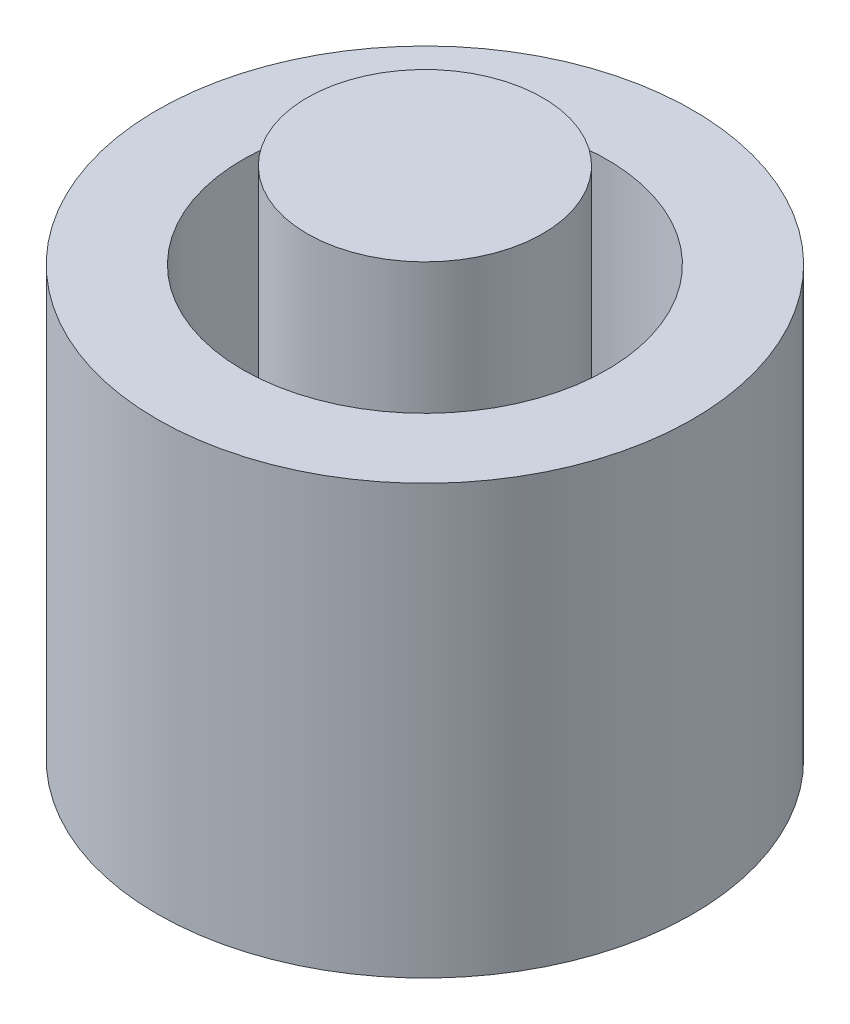
ISO-10303-21;
HEADER;
FILE_DESCRIPTION(('STEP AP214'),'2;1');
FILE_NAME('part.step','',(''),(''),'','','');
FILE_SCHEMA(('AUTOMOTIVE_DESIGN { 1 0 10303 214 1 1 1 1 }'));
ENDSEC;
DATA;
#1=APPLICATION_CONTEXT('core data for automotive mechanical design processes');
#2=APPLICATION_PROTOCOL_DEFINITION('international standard','automotive_design',2000,#1);
#3=PRODUCT_CONTEXT('',#1,'mechanical');
#4=PRODUCT('Part','Part','',(#3));
#5=PRODUCT_RELATED_PRODUCT_CATEGORY('part','',(#4));
#6=PRODUCT_DEFINITION_FORMATION('','',#4);
#7=PRODUCT_DEFINITION_CONTEXT('part definition',#1,'design');
#8=PRODUCT_DEFINITION('design','',#6,#7);
#9=PRODUCT_DEFINITION_SHAPE('','',#8);
#10=(LENGTH_UNIT() NAMED_UNIT(*) SI_UNIT(.MILLI.,.METRE.));
#11=(NAMED_UNIT(*) PLANE_ANGLE_UNIT() SI_UNIT($,.RADIAN.));
#12=(NAMED_UNIT(*) SI_UNIT($,.STERADIAN.) SOLID_ANGLE_UNIT());
#13=UNCERTAINTY_MEASURE_WITH_UNIT(LENGTH_MEASURE(1.E-05),#10,'distance_accuracy_value','');
#14=(GEOMETRIC_REPRESENTATION_CONTEXT(3) GLOBAL_UNCERTAINTY_ASSIGNED_CONTEXT((#13)) GLOBAL_UNIT_ASSIGNED_CONTEXT((#10,
#11,#12)) REPRESENTATION_CONTEXT('',''));
#15=CARTESIAN_POINT('',(0.,0.,0.));
#16=DIRECTION('',(0.,0.,1.));
#17=DIRECTION('',(1.,0.,0.));
#18=AXIS2_PLACEMENT_3D('',#15,#16,#17);
#19=CARTESIAN_POINT('',(0.,10.,0.));
#20=DIRECTION('',(0.,-1.,0.));
#21=DIRECTION('',(0.,0.,-1.));
#22=AXIS2_PLACEMENT_3D('',#19,#20,#21);
#23=CYLINDRICAL_SURFACE('',#22,6.25);
#24=CARTESIAN_POINT('',(0.,10.,0.));
#25=DIRECTION('',(0.,1.,0.));
#26=DIRECTION('',(0.,0.,1.));
#27=AXIS2_PLACEMENT_3D('',#24,#25,#26);
#28=CIRCLE('',#27,6.25);
#29=CARTESIAN_POINT('',(0.,10.,6.25));
#30=VERTEX_POINT('',#29);
#31=EDGE_CURVE('E10',#30,#30,#28,.T.);
#32=ORIENTED_EDGE('',*,*,#31,.F.);
#33=EDGE_LOOP('',(#32));
#34=FACE_BOUND('',#33,.T.);
#35=CARTESIAN_POINT('',(0.,0.,0.));
#36=DIRECTION('',(0.,1.,0.));
#37=DIRECTION('',(0.,0.,1.));
#38=AXIS2_PLACEMENT_3D('',#35,#36,#37);
#39=CIRCLE('',#38,6.25);
#40=CARTESIAN_POINT('',(0.,0.,6.25));
#41=VERTEX_POINT('',#40);
#42=EDGE_CURVE('E40',#41,#41,#39,.T.);
#43=ORIENTED_EDGE('',*,*,#42,.T.);
#44=EDGE_LOOP('',(#43));
#45=FACE_BOUND('',#44,.T.);
#46=ADVANCED_FACE('F37',(#34,#45),#23,.T.);
#47=CARTESIAN_POINT('',(0.,10.,0.));
#48=DIRECTION('',(0.,1.,0.));
#49=DIRECTION('',(0.,0.,1.));
#50=AXIS2_PLACEMENT_3D('',#47,#48,#49);
#51=PLANE('',#50);
#52=CARTESIAN_POINT('',(0.,10.,0.));
#53=DIRECTION('',(0.,1.,0.));
#54=DIRECTION('',(0.,0.,1.));
#55=AXIS2_PLACEMENT_3D('',#52,#53,#54);
#56=CIRCLE('',#55,4.25);
#57=CARTESIAN_POINT('',(0.,10.,4.25));
#58=VERTEX_POINT('',#57);
#59=EDGE_CURVE('E49',#58,#58,#56,.T.);
#60=ORIENTED_EDGE('',*,*,#59,.F.);
#61=EDGE_LOOP('',(#60));
#62=FACE_BOUND('',#61,.T.);
#63=ORIENTED_EDGE('',*,*,#31,.T.);
#64=EDGE_LOOP('',(#63));
#65=FACE_BOUND('',#64,.T.);
#66=ADVANCED_FACE('F89',(#62,#65),#51,.T.);
#67=CARTESIAN_POINT('',(0.,0.,0.));
#68=DIRECTION('',(0.,1.,0.));
#69=DIRECTION('',(0.,0.,1.));
#70=AXIS2_PLACEMENT_3D('',#67,#68,#69);
#71=PLANE('',#70);
#72=ORIENTED_EDGE('',*,*,#42,.F.);
#73=EDGE_LOOP('',(#72));
#74=FACE_BOUND('',#73,.T.);
#75=ADVANCED_FACE('F83',(#74),#71,.F.);
#76=CARTESIAN_POINT('',(0.,10.,0.));
#77=DIRECTION('',(0.,-1.,0.));
#78=DIRECTION('',(0.,0.,-1.));
#79=AXIS2_PLACEMENT_3D('',#76,#77,#78);
#80=CYLINDRICAL_SURFACE('',#79,4.25);
#81=ORIENTED_EDGE('',*,*,#59,.T.);
#82=EDGE_LOOP('',(#81));
#83=FACE_BOUND('',#82,.T.);
#84=CARTESIAN_POINT('',(0.,2.,0.));
#85=DIRECTION('',(0.,1.,0.));
#86=DIRECTION('',(0.,0.,1.));
#87=AXIS2_PLACEMENT_3D('',#84,#85,#86);
#88=CIRCLE('',#87,4.25);
#89=CARTESIAN_POINT('',(0.,2.,4.25));
#90=VERTEX_POINT('',#89);
#91=EDGE_CURVE('E54',#90,#90,#88,.T.);
#92=ORIENTED_EDGE('',*,*,#91,.F.);
#93=EDGE_LOOP('',(#92));
#94=FACE_BOUND('',#93,.T.);
#95=ADVANCED_FACE('F78',(#83,#94),#80,.F.);
#96=CARTESIAN_POINT('',(0.,2.,0.));
#97=DIRECTION('',(0.,1.,0.));
#98=DIRECTION('',(0.,0.,1.));
#99=AXIS2_PLACEMENT_3D('',#96,#97,#98);
#100=PLANE('',#99);
#101=CARTESIAN_POINT('',(0.,2.,0.));
#102=DIRECTION('',(0.,1.,0.));
#103=DIRECTION('',(0.,0.,1.));
#104=AXIS2_PLACEMENT_3D('',#101,#102,#103);
#105=CIRCLE('',#104,2.75);
#106=CARTESIAN_POINT('',(0.,2.,2.75));
#107=VERTEX_POINT('',#106);
#108=EDGE_CURVE('E59',#107,#107,#105,.T.);
#109=ORIENTED_EDGE('',*,*,#108,.F.);
#110=EDGE_LOOP('',(#109));
#111=FACE_BOUND('',#110,.T.);
#112=ORIENTED_EDGE('',*,*,#91,.T.);
#113=EDGE_LOOP('',(#112));
#114=FACE_BOUND('',#113,.T.);
#115=ADVANCED_FACE('F72',(#111,#114),#100,.T.);
#116=CARTESIAN_POINT('',(0.,12.,0.));
#117=DIRECTION('',(0.,-1.,0.));
#118=DIRECTION('',(0.,0.,-1.));
#119=AXIS2_PLACEMENT_3D('',#116,#117,#118);
#120=CYLINDRICAL_SURFACE('',#119,2.75);
#121=CARTESIAN_POINT('',(0.,12.,0.));
#122=DIRECTION('',(0.,1.,0.));
#123=DIRECTION('',(0.,0.,1.));
#124=AXIS2_PLACEMENT_3D('',#121,#122,#123);
#125=CIRCLE('',#124,2.75);
#126=CARTESIAN_POINT('',(0.,12.,2.75));
#127=VERTEX_POINT('',#126);
#128=EDGE_CURVE('E58',#127,#127,#125,.T.);
#129=ORIENTED_EDGE('',*,*,#128,.F.);
#130=EDGE_LOOP('',(#129));
#131=FACE_BOUND('',#130,.T.);
#132=ORIENTED_EDGE('',*,*,#108,.T.);
#133=EDGE_LOOP('',(#132));
#134=FACE_BOUND('',#133,.T.);
#135=ADVANCED_FACE('F69',(#131,#134),#120,.T.);
#136=CARTESIAN_POINT('',(0.,12.,0.));
#137=DIRECTION('',(0.,1.,0.));
#138=DIRECTION('',(0.,0.,1.));
#139=AXIS2_PLACEMENT_3D('',#136,#137,#138);
#140=PLANE('',#139);
#141=ORIENTED_EDGE('',*,*,#128,.T.);
#142=EDGE_LOOP('',(#141));
#143=FACE_BOUND('',#142,.T.);
#144=ADVANCED_FACE('F67',(#143),#140,.T.);
#145=CLOSED_SHELL('',(#46,#66,#75,#95,#115,#135,#144));
#146=MANIFOLD_SOLID_BREP('B2',#145);
#147=ADVANCED_BREP_SHAPE_REPRESENTATION('',(#18,#146),#14);
#148=SHAPE_DEFINITION_REPRESENTATION(#9,#147);
ENDSEC;
END-ISO-10303-21;
